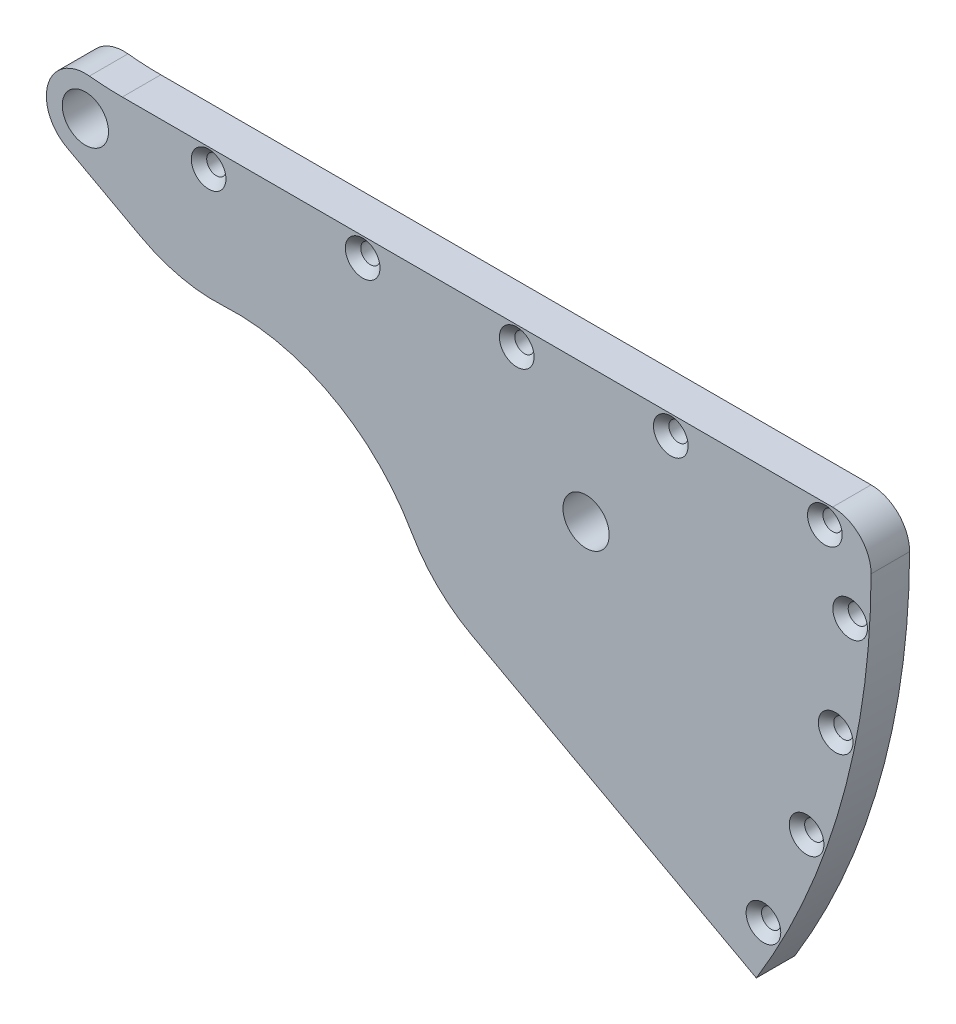
ISO-10303-21;
HEADER;
FILE_DESCRIPTION(('STEP AP214'),'2;1');
FILE_NAME('part.step','',(''),(''),'','','');
FILE_SCHEMA(('AUTOMOTIVE_DESIGN { 1 0 10303 214 1 1 1 1 }'));
ENDSEC;
DATA;
#1=APPLICATION_CONTEXT('core data for automotive mechanical design processes');
#2=APPLICATION_PROTOCOL_DEFINITION('international standard','automotive_design',2000,#1);
#3=PRODUCT_CONTEXT('',#1,'mechanical');
#4=PRODUCT('Part','Part','',(#3));
#5=PRODUCT_RELATED_PRODUCT_CATEGORY('part','',(#4));
#6=PRODUCT_DEFINITION_FORMATION('','',#4);
#7=PRODUCT_DEFINITION_CONTEXT('part definition',#1,'design');
#8=PRODUCT_DEFINITION('design','',#6,#7);
#9=PRODUCT_DEFINITION_SHAPE('','',#8);
#10=(LENGTH_UNIT() NAMED_UNIT(*) SI_UNIT(.MILLI.,.METRE.));
#11=(NAMED_UNIT(*) PLANE_ANGLE_UNIT() SI_UNIT($,.RADIAN.));
#12=(NAMED_UNIT(*) SI_UNIT($,.STERADIAN.) SOLID_ANGLE_UNIT());
#13=UNCERTAINTY_MEASURE_WITH_UNIT(LENGTH_MEASURE(1.E-05),#10,'distance_accuracy_value','');
#14=(GEOMETRIC_REPRESENTATION_CONTEXT(3) GLOBAL_UNCERTAINTY_ASSIGNED_CONTEXT((#13)) GLOBAL_UNIT_ASSIGNED_CONTEXT((#10,
#11,#12)) REPRESENTATION_CONTEXT('',''));
#15=CARTESIAN_POINT('',(0.,0.,0.));
#16=DIRECTION('',(0.,0.,1.));
#17=DIRECTION('',(1.,0.,0.));
#18=AXIS2_PLACEMENT_3D('',#15,#16,#17);
#19=CARTESIAN_POINT('',(-74.8359122898312,-21.2714060431212,10.));
#20=DIRECTION('',(0.477305120545533,0.878737629728587,0.));
#21=DIRECTION('',(-0.878737629728587,0.477305120545533,0.));
#22=AXIS2_PLACEMENT_3D('',#19,#20,#21);
#23=PLANE('',#22);
#24=DIRECTION('',(0.878737629728586,-0.477305120545533,0.));
#25=VECTOR('',#24,1.);
#26=CARTESIAN_POINT('',(-74.8359122898312,-21.2714060431212,0.));
#27=LINE('',#26,#25);
#28=CARTESIAN_POINT('',(-74.8359122898312,-21.2714060431212,0.));
#29=VERTEX_POINT('',#28);
#30=CARTESIAN_POINT('',(-55.4848672615979,-31.7823396453794,0.));
#31=VERTEX_POINT('',#30);
#32=EDGE_CURVE('E149',#29,#31,#27,.T.);
#33=ORIENTED_EDGE('',*,*,#32,.T.);
#34=DIRECTION('',(0.,0.,1.));
#35=VECTOR('',#34,1.);
#36=CARTESIAN_POINT('',(-55.4848672615979,-31.7823396453794,10.));
#37=LINE('',#36,#35);
#38=CARTESIAN_POINT('',(-55.4848672615979,-31.7823396453794,10.));
#39=VERTEX_POINT('',#38);
#40=EDGE_CURVE('E131',#31,#39,#37,.T.);
#41=ORIENTED_EDGE('',*,*,#40,.T.);
#42=DIRECTION('',(0.878737629728586,-0.477305120545533,0.));
#43=VECTOR('',#42,1.);
#44=CARTESIAN_POINT('',(-74.8359122898312,-21.2714060431212,10.));
#45=LINE('',#44,#43);
#46=CARTESIAN_POINT('',(-74.8359122898312,-21.2714060431212,10.));
#47=VERTEX_POINT('',#46);
#48=EDGE_CURVE('E116',#47,#39,#45,.T.);
#49=ORIENTED_EDGE('',*,*,#48,.F.);
#50=DIRECTION('',(0.,0.,-1.));
#51=VECTOR('',#50,1.);
#52=CARTESIAN_POINT('',(-74.8359122898312,-21.2714060431212,10.));
#53=LINE('',#52,#51);
#54=EDGE_CURVE('E125',#47,#29,#53,.T.);
#55=ORIENTED_EDGE('',*,*,#54,.T.);
#56=EDGE_LOOP('',(#33,#41,#49,#55));
#57=FACE_BOUND('',#56,.T.);
#58=ADVANCED_FACE('F33',(#57),#23,.F.);
#59=CARTESIAN_POINT('',(-70.,-12.3683000000001,10.));
#60=DIRECTION('',(0.,0.,1.));
#61=DIRECTION('',(1.,0.,0.));
#62=AXIS2_PLACEMENT_3D('',#59,#60,#61);
#63=PLANE('',#62);
#64=CARTESIAN_POINT('',(124.804036909517,-53.0178658495351,10.));
#65=DIRECTION('',(0.,0.,1.));
#66=DIRECTION('',(1.,0.,0.));
#67=AXIS2_PLACEMENT_3D('',#64,#65,#66);
#68=CIRCLE('',#67,4.50000000000001);
#69=CARTESIAN_POINT('',(129.304036909517,-53.0178658495351,10.));
#70=VERTEX_POINT('',#69);
#71=EDGE_CURVE('E228',#70,#70,#68,.F.);
#72=ORIENTED_EDGE('',*,*,#71,.T.);
#73=EDGE_LOOP('',(#72));
#74=FACE_BOUND('',#73,.T.);
#75=CARTESIAN_POINT('',(117.250891281488,-79.7337489652391,10.));
#76=DIRECTION('',(0.,0.,1.));
#77=DIRECTION('',(1.,0.,0.));
#78=AXIS2_PLACEMENT_3D('',#75,#76,#77);
#79=CIRCLE('',#78,4.49999999999997);
#80=CARTESIAN_POINT('',(121.750891281488,-79.7337489652391,10.));
#81=VERTEX_POINT('',#80);
#82=EDGE_CURVE('E222',#81,#81,#79,.F.);
#83=ORIENTED_EDGE('',*,*,#82,.T.);
#84=EDGE_LOOP('',(#83));
#85=FACE_BOUND('',#84,.T.);
#86=CARTESIAN_POINT('',(106.053120049398,-105.138440243897,10.));
#87=DIRECTION('',(0.,0.,1.));
#88=DIRECTION('',(1.,0.,0.));
#89=AXIS2_PLACEMENT_3D('',#86,#87,#88);
#90=CIRCLE('',#89,4.49999999999998);
#91=CARTESIAN_POINT('',(110.553120049398,-105.138440243897,10.));
#92=VERTEX_POINT('',#91);
#93=EDGE_CURVE('E216',#92,#92,#90,.F.);
#94=ORIENTED_EDGE('',*,*,#93,.T.);
#95=EDGE_LOOP('',(#94));
#96=FACE_BOUND('',#95,.T.);
#97=CARTESIAN_POINT('',(128.565543545409,-25.5107851727687,10.));
#98=DIRECTION('',(0.,0.,1.));
#99=DIRECTION('',(1.,0.,0.));
#100=AXIS2_PLACEMENT_3D('',#97,#98,#99);
#101=CIRCLE('',#100,4.50000000000003);
#102=CARTESIAN_POINT('',(133.065543545409,-25.5107851727687,10.));
#103=VERTEX_POINT('',#102);
#104=EDGE_CURVE('E210',#103,#103,#101,.F.);
#105=ORIENTED_EDGE('',*,*,#104,.T.);
#106=EDGE_LOOP('',(#105));
#107=FACE_BOUND('',#106,.T.);
#108=CARTESIAN_POINT('',(-38.,-7.73660000000008,10.));
#109=DIRECTION('',(0.,0.,1.));
#110=DIRECTION('',(1.,0.,0.));
#111=AXIS2_PLACEMENT_3D('',#108,#109,#110);
#112=CIRCLE('',#111,4.50000000000003);
#113=CARTESIAN_POINT('',(-33.5,-7.73660000000008,10.));
#114=VERTEX_POINT('',#113);
#115=EDGE_CURVE('E204',#114,#114,#112,.F.);
#116=ORIENTED_EDGE('',*,*,#115,.T.);
#117=EDGE_LOOP('',(#116));
#118=FACE_BOUND('',#117,.T.);
#119=CARTESIAN_POINT('',(1.99999999999999,-7.73660000000007,10.));
#120=DIRECTION('',(0.,0.,1.));
#121=DIRECTION('',(1.,0.,0.));
#122=AXIS2_PLACEMENT_3D('',#119,#120,#121);
#123=CIRCLE('',#122,4.50000000000003);
#124=CARTESIAN_POINT('',(6.50000000000002,-7.73660000000007,10.));
#125=VERTEX_POINT('',#124);
#126=EDGE_CURVE('E198',#125,#125,#123,.F.);
#127=ORIENTED_EDGE('',*,*,#126,.T.);
#128=EDGE_LOOP('',(#127));
#129=FACE_BOUND('',#128,.T.);
#130=CARTESIAN_POINT('',(42.,-7.73660000000007,10.));
#131=DIRECTION('',(0.,0.,1.));
#132=DIRECTION('',(1.,0.,0.));
#133=AXIS2_PLACEMENT_3D('',#130,#131,#132);
#134=CIRCLE('',#133,4.50000000000003);
#135=CARTESIAN_POINT('',(46.5,-7.73660000000007,10.));
#136=VERTEX_POINT('',#135);
#137=EDGE_CURVE('E192',#136,#136,#134,.F.);
#138=ORIENTED_EDGE('',*,*,#137,.T.);
#139=EDGE_LOOP('',(#138));
#140=FACE_BOUND('',#139,.T.);
#141=CARTESIAN_POINT('',(82.,-7.73660000000007,10.));
#142=DIRECTION('',(0.,0.,1.));
#143=DIRECTION('',(1.,0.,0.));
#144=AXIS2_PLACEMENT_3D('',#141,#142,#143);
#145=CIRCLE('',#144,4.50000000000003);
#146=CARTESIAN_POINT('',(86.5,-7.73660000000007,10.));
#147=VERTEX_POINT('',#146);
#148=EDGE_CURVE('E186',#147,#147,#145,.F.);
#149=ORIENTED_EDGE('',*,*,#148,.T.);
#150=EDGE_LOOP('',(#149));
#151=FACE_BOUND('',#150,.T.);
#152=CARTESIAN_POINT('',(122.,-7.73660000000007,10.));
#153=DIRECTION('',(0.,0.,1.));
#154=DIRECTION('',(1.,0.,0.));
#155=AXIS2_PLACEMENT_3D('',#152,#153,#154);
#156=CIRCLE('',#155,4.5000000000001);
#157=CARTESIAN_POINT('',(126.5,-7.73660000000007,10.));
#158=VERTEX_POINT('',#157);
#159=EDGE_CURVE('E171',#158,#158,#156,.F.);
#160=ORIENTED_EDGE('',*,*,#159,.T.);
#161=EDGE_LOOP('',(#160));
#162=FACE_BOUND('',#161,.T.);
#163=CARTESIAN_POINT('',(-70.,-12.3683000000001,10.));
#164=DIRECTION('',(0.,0.,1.));
#165=DIRECTION('',(1.,0.,0.));
#166=AXIS2_PLACEMENT_3D('',#163,#164,#165);
#167=CIRCLE('',#166,204.);
#168=CARTESIAN_POINT('',(104.20534041752,-118.52148822351,10.));
#169=VERTEX_POINT('',#168);
#170=CARTESIAN_POINT('',(133.999632378806,-12.7555845360825,10.));
#171=VERTEX_POINT('',#170);
#172=EDGE_CURVE('E150',#169,#171,#167,.T.);
#173=ORIENTED_EDGE('',*,*,#172,.T.);
#174=CARTESIAN_POINT('',(123.999650399453,-12.7366000000001,10.));
#175=DIRECTION('',(0.,0.,1.));
#176=DIRECTION('',(1.,0.,0.));
#177=AXIS2_PLACEMENT_3D('',#174,#175,#176);
#178=CIRCLE('',#177,10.);
#179=CARTESIAN_POINT('',(123.999650399453,-2.73660000000007,10.));
#180=VERTEX_POINT('',#179);
#181=EDGE_CURVE('E181',#171,#180,#178,.T.);
#182=ORIENTED_EDGE('',*,*,#181,.T.);
#183=DIRECTION('',(-1.,0.,0.));
#184=VECTOR('',#183,1.);
#185=CARTESIAN_POINT('',(134.,-2.73660000000007,10.));
#186=LINE('',#185,#184);
#187=CARTESIAN_POINT('',(-60.4145057508754,-2.73660000000008,10.));
#188=VERTEX_POINT('',#187);
#189=EDGE_CURVE('E122',#180,#188,#186,.T.);
#190=ORIENTED_EDGE('',*,*,#189,.T.);
#191=CARTESIAN_POINT('',(-60.4145057508754,79.2633999999999,10.));
#192=DIRECTION('',(0.,0.,1.));
#193=DIRECTION('',(1.,0.,0.));
#194=AXIS2_PLACEMENT_3D('',#191,#192,#193);
#195=CIRCLE('',#194,82.);
#196=CARTESIAN_POINT('',(-68.9458855954698,-2.29158487491284,10.));
#197=VERTEX_POINT('',#196);
#198=EDGE_CURVE('E11',#188,#197,#195,.F.);
#199=ORIENTED_EDGE('',*,*,#198,.T.);
#200=CARTESIAN_POINT('',(-70.,-12.3683000000001,10.));
#201=DIRECTION('',(0.,0.,1.));
#202=DIRECTION('',(1.,0.,0.));
#203=AXIS2_PLACEMENT_3D('',#200,#201,#202);
#204=CIRCLE('',#203,10.1317);
#205=EDGE_CURVE('E110',#197,#47,#204,.T.);
#206=ORIENTED_EDGE('',*,*,#205,.T.);
#207=ORIENTED_EDGE('',*,*,#48,.T.);
#208=CARTESIAN_POINT('',(-36.3926624397765,3.36716554376406,10.));
#209=DIRECTION('',(0.,0.,1.));
#210=DIRECTION('',(1.,0.,0.));
#211=AXIS2_PLACEMENT_3D('',#208,#209,#210);
#212=CIRCLE('',#211,40.);
#213=CARTESIAN_POINT('',(-34.1104429036796,-36.5676748088536,10.));
#214=VERTEX_POINT('',#213);
#215=EDGE_CURVE('E155',#39,#214,#212,.T.);
#216=ORIENTED_EDGE('',*,*,#215,.T.);
#217=CARTESIAN_POINT('',(-31.1020131785029,-89.2099201699054,10.));
#218=DIRECTION('',(0.,0.,1.));
#219=DIRECTION('',(1.,0.,0.));
#220=AXIS2_PLACEMENT_3D('',#217,#218,#219);
#221=CIRCLE('',#220,52.7281390347176);
#222=CARTESIAN_POINT('',(14.6947042322307,-63.0772333492602,10.));
#223=VERTEX_POINT('',#222);
#224=EDGE_CURVE('E242',#223,#214,#221,.T.);
#225=ORIENTED_EDGE('',*,*,#224,.F.);
#226=CARTESIAN_POINT('',(49.4364707721648,-43.2527621662824,10.));
#227=DIRECTION('',(0.,0.,1.));
#228=DIRECTION('',(1.,0.,0.));
#229=AXIS2_PLACEMENT_3D('',#226,#227,#228);
#230=CIRCLE('',#229,40.);
#231=CARTESIAN_POINT('',(30.3442659503435,-78.4022673554259,10.));
#232=VERTEX_POINT('',#231);
#233=EDGE_CURVE('E153',#223,#232,#230,.T.);
#234=ORIENTED_EDGE('',*,*,#233,.T.);
#235=EDGE_CURVE('E121',#232,#169,#45,.T.);
#236=ORIENTED_EDGE('',*,*,#235,.T.);
#237=EDGE_LOOP('',(#173,#182,#190,#199,#206,#207,#216,#225,#234,#236));
#238=FACE_BOUND('',#237,.T.);
#239=CARTESIAN_POINT('',(60.,-38.0000000000001,10.));
#240=DIRECTION('',(0.,0.,1.));
#241=DIRECTION('',(1.,0.,0.));
#242=AXIS2_PLACEMENT_3D('',#239,#240,#241);
#243=CIRCLE('',#242,6.);
#244=CARTESIAN_POINT('',(66.,-38.0000000000001,10.));
#245=VERTEX_POINT('',#244);
#246=EDGE_CURVE('E259',#245,#245,#243,.T.);
#247=ORIENTED_EDGE('',*,*,#246,.F.);
#248=EDGE_LOOP('',(#247));
#249=FACE_BOUND('',#248,.T.);
#250=CARTESIAN_POINT('',(-70.,-12.3683000000001,10.));
#251=DIRECTION('',(0.,0.,1.));
#252=DIRECTION('',(1.,0.,0.));
#253=AXIS2_PLACEMENT_3D('',#250,#251,#252);
#254=CIRCLE('',#253,6.);
#255=CARTESIAN_POINT('',(-64.,-12.3683000000001,10.));
#256=VERTEX_POINT('',#255);
#257=EDGE_CURVE('E251',#256,#256,#254,.T.);
#258=ORIENTED_EDGE('',*,*,#257,.F.);
#259=EDGE_LOOP('',(#258));
#260=FACE_BOUND('',#259,.T.);
#261=ADVANCED_FACE('F113',(#74,#85,#96,#107,#118,#129,#140,#151,#162,#238,#249,#260),#63,.T.);
#262=CARTESIAN_POINT('',(-70.,-12.3683000000001,0.));
#263=DIRECTION('',(0.,0.,1.));
#264=DIRECTION('',(1.,0.,0.));
#265=AXIS2_PLACEMENT_3D('',#262,#263,#264);
#266=PLANE('',#265);
#267=CARTESIAN_POINT('',(106.053120049398,-105.138440243897,0.));
#268=DIRECTION('',(0.,0.,1.));
#269=DIRECTION('',(0.913545457642606,-0.406736643075789,0.));
#270=AXIS2_PLACEMENT_3D('',#267,#268,#269);
#271=CIRCLE('',#270,2.5);
#272=CARTESIAN_POINT('',(108.336983693504,-106.155281851586,0.));
#273=VERTEX_POINT('',#272);
#274=EDGE_CURVE('E373',#273,#273,#271,.T.);
#275=ORIENTED_EDGE('',*,*,#274,.T.);
#276=EDGE_LOOP('',(#275));
#277=FACE_BOUND('',#276,.T.);
#278=CARTESIAN_POINT('',(117.250891281488,-79.7337489652391,0.));
#279=DIRECTION('',(0.,0.,1.));
#280=DIRECTION('',(0.961261695938322,-0.275637355816987,0.));
#281=AXIS2_PLACEMENT_3D('',#278,#279,#280);
#282=CIRCLE('',#281,2.5);
#283=CARTESIAN_POINT('',(119.654045521334,-80.4228423547816,0.));
#284=VERTEX_POINT('',#283);
#285=EDGE_CURVE('E371',#284,#284,#282,.T.);
#286=ORIENTED_EDGE('',*,*,#285,.T.);
#287=EDGE_LOOP('',(#286));
#288=FACE_BOUND('',#287,.T.);
#289=CARTESIAN_POINT('',(124.804036909517,-53.0178658495351,0.));
#290=DIRECTION('',(0.,0.,1.));
#291=DIRECTION('',(0.990268068741572,-0.139173100960052,0.));
#292=AXIS2_PLACEMENT_3D('',#289,#290,#291);
#293=CIRCLE('',#292,2.5);
#294=CARTESIAN_POINT('',(127.27970708137,-53.3657986019352,0.));
#295=VERTEX_POINT('',#294);
#296=EDGE_CURVE('E374',#295,#295,#293,.T.);
#297=ORIENTED_EDGE('',*,*,#296,.T.);
#298=EDGE_LOOP('',(#297));
#299=FACE_BOUND('',#298,.T.);
#300=CARTESIAN_POINT('',(128.565543545409,-25.5107851727687,0.));
#301=DIRECTION('',(0.,0.,1.));
#302=DIRECTION('',(1.,0.,0.));
#303=AXIS2_PLACEMENT_3D('',#300,#301,#302);
#304=CIRCLE('',#303,2.5);
#305=CARTESIAN_POINT('',(131.065543545409,-25.5107851727687,0.));
#306=VERTEX_POINT('',#305);
#307=EDGE_CURVE('E377',#306,#306,#304,.T.);
#308=ORIENTED_EDGE('',*,*,#307,.T.);
#309=EDGE_LOOP('',(#308));
#310=FACE_BOUND('',#309,.T.);
#311=CARTESIAN_POINT('',(82.,-7.73660000000007,0.));
#312=DIRECTION('',(0.,0.,1.));
#313=DIRECTION('',(1.,0.,0.));
#314=AXIS2_PLACEMENT_3D('',#311,#312,#313);
#315=CIRCLE('',#314,2.49999999999999);
#316=CARTESIAN_POINT('',(84.5,-7.73660000000007,0.));
#317=VERTEX_POINT('',#316);
#318=EDGE_CURVE('E254',#317,#317,#315,.T.);
#319=ORIENTED_EDGE('',*,*,#318,.T.);
#320=EDGE_LOOP('',(#319));
#321=FACE_BOUND('',#320,.T.);
#322=CARTESIAN_POINT('',(42.,-7.73660000000007,0.));
#323=DIRECTION('',(0.,0.,1.));
#324=DIRECTION('',(1.,0.,0.));
#325=AXIS2_PLACEMENT_3D('',#322,#323,#324);
#326=CIRCLE('',#325,2.49999999999999);
#327=CARTESIAN_POINT('',(44.5,-7.73660000000007,0.));
#328=VERTEX_POINT('',#327);
#329=EDGE_CURVE('E387',#328,#328,#326,.T.);
#330=ORIENTED_EDGE('',*,*,#329,.T.);
#331=EDGE_LOOP('',(#330));
#332=FACE_BOUND('',#331,.T.);
#333=CARTESIAN_POINT('',(1.99999999999999,-7.73660000000007,0.));
#334=DIRECTION('',(0.,0.,1.));
#335=DIRECTION('',(1.,0.,0.));
#336=AXIS2_PLACEMENT_3D('',#333,#334,#335);
#337=CIRCLE('',#336,2.49999999999999);
#338=CARTESIAN_POINT('',(4.49999999999998,-7.73660000000007,0.));
#339=VERTEX_POINT('',#338);
#340=EDGE_CURVE('E390',#339,#339,#337,.T.);
#341=ORIENTED_EDGE('',*,*,#340,.T.);
#342=EDGE_LOOP('',(#341));
#343=FACE_BOUND('',#342,.T.);
#344=CARTESIAN_POINT('',(-38.,-7.73660000000008,0.));
#345=DIRECTION('',(0.,0.,1.));
#346=DIRECTION('',(1.,0.,0.));
#347=AXIS2_PLACEMENT_3D('',#344,#345,#346);
#348=CIRCLE('',#347,2.49999999999999);
#349=CARTESIAN_POINT('',(-35.5,-7.73660000000008,0.));
#350=VERTEX_POINT('',#349);
#351=EDGE_CURVE('E384',#350,#350,#348,.T.);
#352=ORIENTED_EDGE('',*,*,#351,.T.);
#353=EDGE_LOOP('',(#352));
#354=FACE_BOUND('',#353,.T.);
#355=CARTESIAN_POINT('',(122.,-7.73660000000007,0.));
#356=DIRECTION('',(0.,0.,1.));
#357=DIRECTION('',(1.,0.,0.));
#358=AXIS2_PLACEMENT_3D('',#355,#356,#357);
#359=CIRCLE('',#358,2.49999999999999);
#360=CARTESIAN_POINT('',(124.5,-7.73660000000007,0.));
#361=VERTEX_POINT('',#360);
#362=EDGE_CURVE('E249',#361,#361,#359,.T.);
#363=ORIENTED_EDGE('',*,*,#362,.T.);
#364=EDGE_LOOP('',(#363));
#365=FACE_BOUND('',#364,.T.);
#366=CARTESIAN_POINT('',(60.,-38.0000000000001,0.));
#367=DIRECTION('',(0.,0.,1.));
#368=DIRECTION('',(1.,0.,0.));
#369=AXIS2_PLACEMENT_3D('',#366,#367,#368);
#370=CIRCLE('',#369,6.);
#371=CARTESIAN_POINT('',(66.,-38.0000000000001,0.));
#372=VERTEX_POINT('',#371);
#373=EDGE_CURVE('E145',#372,#372,#370,.T.);
#374=ORIENTED_EDGE('',*,*,#373,.T.);
#375=EDGE_LOOP('',(#374));
#376=FACE_BOUND('',#375,.T.);
#377=CARTESIAN_POINT('',(-70.,-12.3683000000001,0.));
#378=DIRECTION('',(0.,0.,1.));
#379=DIRECTION('',(1.,0.,0.));
#380=AXIS2_PLACEMENT_3D('',#377,#378,#379);
#381=CIRCLE('',#380,6.);
#382=CARTESIAN_POINT('',(-64.,-12.3683000000001,0.));
#383=VERTEX_POINT('',#382);
#384=EDGE_CURVE('E262',#383,#383,#381,.T.);
#385=ORIENTED_EDGE('',*,*,#384,.T.);
#386=EDGE_LOOP('',(#385));
#387=FACE_BOUND('',#386,.T.);
#388=DIRECTION('',(-1.,0.,0.));
#389=VECTOR('',#388,1.);
#390=CARTESIAN_POINT('',(134.,-2.73660000000007,0.));
#391=LINE('',#390,#389);
#392=CARTESIAN_POINT('',(123.999650399453,-2.73660000000007,0.));
#393=VERTEX_POINT('',#392);
#394=CARTESIAN_POINT('',(-60.4145057508754,-2.73660000000008,0.));
#395=VERTEX_POINT('',#394);
#396=EDGE_CURVE('E144',#393,#395,#391,.T.);
#397=ORIENTED_EDGE('',*,*,#396,.F.);
#398=CARTESIAN_POINT('',(123.999650399453,-12.7366000000001,0.));
#399=DIRECTION('',(0.,0.,1.));
#400=DIRECTION('',(1.,0.,0.));
#401=AXIS2_PLACEMENT_3D('',#398,#399,#400);
#402=CIRCLE('',#401,10.);
#403=CARTESIAN_POINT('',(133.999632378806,-12.7555845360825,0.));
#404=VERTEX_POINT('',#403);
#405=EDGE_CURVE('E177',#393,#404,#402,.F.);
#406=ORIENTED_EDGE('',*,*,#405,.T.);
#407=CARTESIAN_POINT('',(-70.,-12.3683000000003,0.));
#408=DIRECTION('',(0.,0.,1.));
#409=DIRECTION('',(1.,0.,0.));
#410=AXIS2_PLACEMENT_3D('',#407,#408,#409);
#411=CIRCLE('',#410,204.);
#412=CARTESIAN_POINT('',(104.20534041752,-118.52148822351,0.));
#413=VERTEX_POINT('',#412);
#414=EDGE_CURVE('E141',#413,#404,#411,.T.);
#415=ORIENTED_EDGE('',*,*,#414,.F.);
#416=CARTESIAN_POINT('',(30.3442659503435,-78.4022673554259,0.));
#417=VERTEX_POINT('',#416);
#418=EDGE_CURVE('E148',#417,#413,#27,.T.);
#419=ORIENTED_EDGE('',*,*,#418,.F.);
#420=CARTESIAN_POINT('',(49.4364707721648,-43.2527621662824,0.));
#421=DIRECTION('',(0.,0.,1.));
#422=DIRECTION('',(1.,0.,0.));
#423=AXIS2_PLACEMENT_3D('',#420,#421,#422);
#424=CIRCLE('',#423,40.);
#425=CARTESIAN_POINT('',(14.6947042322307,-63.0772333492602,0.));
#426=VERTEX_POINT('',#425);
#427=EDGE_CURVE('E161',#417,#426,#424,.F.);
#428=ORIENTED_EDGE('',*,*,#427,.T.);
#429=CARTESIAN_POINT('',(-31.1020131785029,-89.2099201699054,0.));
#430=DIRECTION('',(0.,0.,1.));
#431=DIRECTION('',(1.,0.,0.));
#432=AXIS2_PLACEMENT_3D('',#429,#430,#431);
#433=CIRCLE('',#432,52.7281390347176);
#434=CARTESIAN_POINT('',(-34.1104429036796,-36.5676748088536,0.));
#435=VERTEX_POINT('',#434);
#436=EDGE_CURVE('E248',#426,#435,#433,.T.);
#437=ORIENTED_EDGE('',*,*,#436,.T.);
#438=CARTESIAN_POINT('',(-36.3926624397765,3.36716554376406,0.));
#439=DIRECTION('',(0.,0.,1.));
#440=DIRECTION('',(1.,0.,0.));
#441=AXIS2_PLACEMENT_3D('',#438,#439,#440);
#442=CIRCLE('',#441,40.);
#443=EDGE_CURVE('E163',#435,#31,#442,.F.);
#444=ORIENTED_EDGE('',*,*,#443,.T.);
#445=ORIENTED_EDGE('',*,*,#32,.F.);
#446=CARTESIAN_POINT('',(-70.,-12.3683000000001,0.));
#447=DIRECTION('',(0.,0.,1.));
#448=DIRECTION('',(1.,0.,0.));
#449=AXIS2_PLACEMENT_3D('',#446,#447,#448);
#450=CIRCLE('',#449,10.1317);
#451=CARTESIAN_POINT('',(-68.9458855954698,-2.29158487491284,0.));
#452=VERTEX_POINT('',#451);
#453=EDGE_CURVE('E127',#452,#29,#450,.T.);
#454=ORIENTED_EDGE('',*,*,#453,.F.);
#455=CARTESIAN_POINT('',(-60.4145057508754,79.2633999999999,0.));
#456=DIRECTION('',(0.,0.,1.));
#457=DIRECTION('',(1.,0.,0.));
#458=AXIS2_PLACEMENT_3D('',#455,#456,#457);
#459=CIRCLE('',#458,82.);
#460=EDGE_CURVE('E41',#452,#395,#459,.T.);
#461=ORIENTED_EDGE('',*,*,#460,.T.);
#462=EDGE_LOOP('',(#397,#406,#415,#419,#428,#437,#444,#445,#454,#461));
#463=FACE_BOUND('',#462,.T.);
#464=ADVANCED_FACE('F234',(#277,#288,#299,#310,#321,#332,#343,#354,#365,#376,#387,#463),#266,.F.);
#465=CARTESIAN_POINT('',(-70.,-12.3683000000003,10.));
#466=DIRECTION('',(0.,0.,-1.));
#467=DIRECTION('',(-1.,0.,0.));
#468=AXIS2_PLACEMENT_3D('',#465,#466,#467);
#469=CYLINDRICAL_SURFACE('',#468,204.);
#470=ORIENTED_EDGE('',*,*,#414,.T.);
#471=DIRECTION('',(0.,0.,-1.));
#472=VECTOR('',#471,1.);
#473=CARTESIAN_POINT('',(133.999632378806,-12.7555845360825,10.));
#474=LINE('',#473,#472);
#475=EDGE_CURVE('E179',#404,#171,#474,.F.);
#476=ORIENTED_EDGE('',*,*,#475,.T.);
#477=ORIENTED_EDGE('',*,*,#172,.F.);
#478=DIRECTION('',(0.,0.,-1.));
#479=VECTOR('',#478,1.);
#480=CARTESIAN_POINT('',(104.20534041752,-118.52148822351,10.));
#481=LINE('',#480,#479);
#482=EDGE_CURVE('E132',#169,#413,#481,.T.);
#483=ORIENTED_EDGE('',*,*,#482,.T.);
#484=EDGE_LOOP('',(#470,#476,#477,#483));
#485=FACE_BOUND('',#484,.T.);
#486=ADVANCED_FACE('F307',(#485),#469,.T.);
#487=CARTESIAN_POINT('',(134.,-2.73660000000007,10.));
#488=DIRECTION('',(0.,-1.,0.));
#489=DIRECTION('',(1.,0.,0.));
#490=AXIS2_PLACEMENT_3D('',#487,#488,#489);
#491=PLANE('',#490);
#492=ORIENTED_EDGE('',*,*,#396,.T.);
#493=DIRECTION('',(0.,0.,1.));
#494=VECTOR('',#493,1.);
#495=CARTESIAN_POINT('',(-60.4145057508754,-2.73660000000008,10.));
#496=LINE('',#495,#494);
#497=EDGE_CURVE('E54',#395,#188,#496,.T.);
#498=ORIENTED_EDGE('',*,*,#497,.T.);
#499=ORIENTED_EDGE('',*,*,#189,.F.);
#500=DIRECTION('',(0.,0.,-1.));
#501=VECTOR('',#500,1.);
#502=CARTESIAN_POINT('',(123.999650399453,-2.73660000000007,10.));
#503=LINE('',#502,#501);
#504=EDGE_CURVE('E174',#180,#393,#503,.T.);
#505=ORIENTED_EDGE('',*,*,#504,.T.);
#506=EDGE_LOOP('',(#492,#498,#499,#505));
#507=FACE_BOUND('',#506,.T.);
#508=ADVANCED_FACE('F296',(#507),#491,.F.);
#509=CARTESIAN_POINT('',(-70.,-12.3683000000001,10.));
#510=DIRECTION('',(0.,0.,-1.));
#511=DIRECTION('',(-1.,0.,0.));
#512=AXIS2_PLACEMENT_3D('',#509,#510,#511);
#513=CYLINDRICAL_SURFACE('',#512,10.1317);
#514=ORIENTED_EDGE('',*,*,#205,.F.);
#515=DIRECTION('',(0.,0.,-1.));
#516=VECTOR('',#515,1.);
#517=CARTESIAN_POINT('',(-68.9458855954698,-2.29158487491284,10.));
#518=LINE('',#517,#516);
#519=EDGE_CURVE('E231',#197,#452,#518,.T.);
#520=ORIENTED_EDGE('',*,*,#519,.T.);
#521=ORIENTED_EDGE('',*,*,#453,.T.);
#522=ORIENTED_EDGE('',*,*,#54,.F.);
#523=EDGE_LOOP('',(#514,#520,#521,#522));
#524=FACE_BOUND('',#523,.T.);
#525=ADVANCED_FACE('F126',(#524),#513,.T.);
#526=ORIENTED_EDGE('',*,*,#235,.F.);
#527=DIRECTION('',(0.,0.,1.));
#528=VECTOR('',#527,1.);
#529=CARTESIAN_POINT('',(30.3442659503435,-78.4022673554258,10.));
#530=LINE('',#529,#528);
#531=EDGE_CURVE('E165',#232,#417,#530,.F.);
#532=ORIENTED_EDGE('',*,*,#531,.T.);
#533=ORIENTED_EDGE('',*,*,#418,.T.);
#534=ORIENTED_EDGE('',*,*,#482,.F.);
#535=EDGE_LOOP('',(#526,#532,#533,#534));
#536=FACE_BOUND('',#535,.T.);
#537=ADVANCED_FACE('F278',(#536),#23,.F.);
#538=CARTESIAN_POINT('',(-70.,-12.3683000000001,0.));
#539=DIRECTION('',(0.,0.,1.));
#540=DIRECTION('',(1.,0.,0.));
#541=AXIS2_PLACEMENT_3D('',#538,#539,#540);
#542=CYLINDRICAL_SURFACE('',#541,6.);
#543=ORIENTED_EDGE('',*,*,#384,.F.);
#544=EDGE_LOOP('',(#543));
#545=FACE_BOUND('',#544,.T.);
#546=ORIENTED_EDGE('',*,*,#257,.T.);
#547=EDGE_LOOP('',(#546));
#548=FACE_BOUND('',#547,.T.);
#549=ADVANCED_FACE('F287',(#545,#548),#542,.F.);
#550=CARTESIAN_POINT('',(60.,-38.0000000000001,0.));
#551=DIRECTION('',(0.,0.,1.));
#552=DIRECTION('',(1.,0.,0.));
#553=AXIS2_PLACEMENT_3D('',#550,#551,#552);
#554=CYLINDRICAL_SURFACE('',#553,6.);
#555=ORIENTED_EDGE('',*,*,#373,.F.);
#556=EDGE_LOOP('',(#555));
#557=FACE_BOUND('',#556,.T.);
#558=ORIENTED_EDGE('',*,*,#246,.T.);
#559=EDGE_LOOP('',(#558));
#560=FACE_BOUND('',#559,.T.);
#561=ADVANCED_FACE('F293',(#557,#560),#554,.F.);
#562=CARTESIAN_POINT('',(-31.1020131785029,-89.2099201699054,0.));
#563=DIRECTION('',(0.,0.,1.));
#564=DIRECTION('',(1.,0.,0.));
#565=AXIS2_PLACEMENT_3D('',#562,#563,#564);
#566=CYLINDRICAL_SURFACE('',#565,52.7281390347176);
#567=ORIENTED_EDGE('',*,*,#224,.T.);
#568=DIRECTION('',(0.,0.,1.));
#569=VECTOR('',#568,1.);
#570=CARTESIAN_POINT('',(-34.1104429036796,-36.5676748088536,0.));
#571=LINE('',#570,#569);
#572=EDGE_CURVE('E159',#214,#435,#571,.F.);
#573=ORIENTED_EDGE('',*,*,#572,.T.);
#574=ORIENTED_EDGE('',*,*,#436,.F.);
#575=DIRECTION('',(0.,0.,1.));
#576=VECTOR('',#575,1.);
#577=CARTESIAN_POINT('',(14.6947042322307,-63.0772333492602,0.));
#578=LINE('',#577,#576);
#579=EDGE_CURVE('E157',#426,#223,#578,.T.);
#580=ORIENTED_EDGE('',*,*,#579,.T.);
#581=EDGE_LOOP('',(#567,#573,#574,#580));
#582=FACE_BOUND('',#581,.T.);
#583=ADVANCED_FACE('F245',(#582),#566,.F.);
#584=CARTESIAN_POINT('',(-36.3926624397765,3.36716554376406,0.));
#585=DIRECTION('',(0.,0.,1.));
#586=DIRECTION('',(1.,0.,0.));
#587=AXIS2_PLACEMENT_3D('',#584,#585,#586);
#588=CYLINDRICAL_SURFACE('',#587,40.);
#589=ORIENTED_EDGE('',*,*,#443,.F.);
#590=ORIENTED_EDGE('',*,*,#572,.F.);
#591=ORIENTED_EDGE('',*,*,#215,.F.);
#592=ORIENTED_EDGE('',*,*,#40,.F.);
#593=EDGE_LOOP('',(#589,#590,#591,#592));
#594=FACE_BOUND('',#593,.T.);
#595=ADVANCED_FACE('F238',(#594),#588,.T.);
#596=CARTESIAN_POINT('',(49.4364707721648,-43.2527621662824,0.));
#597=DIRECTION('',(0.,0.,1.));
#598=DIRECTION('',(1.,0.,0.));
#599=AXIS2_PLACEMENT_3D('',#596,#597,#598);
#600=CYLINDRICAL_SURFACE('',#599,40.);
#601=ORIENTED_EDGE('',*,*,#233,.F.);
#602=ORIENTED_EDGE('',*,*,#579,.F.);
#603=ORIENTED_EDGE('',*,*,#427,.F.);
#604=ORIENTED_EDGE('',*,*,#531,.F.);
#605=EDGE_LOOP('',(#601,#602,#603,#604));
#606=FACE_BOUND('',#605,.T.);
#607=ADVANCED_FACE('F303',(#606),#600,.T.);
#608=CARTESIAN_POINT('',(122.,-7.73660000000007,0.));
#609=DIRECTION('',(0.,0.,1.));
#610=DIRECTION('',(1.,0.,0.));
#611=AXIS2_PLACEMENT_3D('',#608,#609,#610);
#612=CYLINDRICAL_SURFACE('',#611,2.49999999999999);
#613=CARTESIAN_POINT('',(122.,-7.73660000000007,7.99999999999993));
#614=DIRECTION('',(0.,0.,1.));
#615=DIRECTION('',(1.,0.,0.));
#616=AXIS2_PLACEMENT_3D('',#613,#614,#615);
#617=CIRCLE('',#616,2.49999999999999);
#618=CARTESIAN_POINT('',(124.5,-7.73660000000007,7.99999999999993));
#619=VERTEX_POINT('',#618);
#620=EDGE_CURVE('E168',#619,#619,#617,.T.);
#621=ORIENTED_EDGE('',*,*,#620,.T.);
#622=EDGE_LOOP('',(#621));
#623=FACE_BOUND('',#622,.T.);
#624=ORIENTED_EDGE('',*,*,#362,.F.);
#625=EDGE_LOOP('',(#624));
#626=FACE_BOUND('',#625,.T.);
#627=ADVANCED_FACE('F321',(#623,#626),#612,.F.);
#628=CARTESIAN_POINT('',(122.,-7.73660000000007,7.99999999999993));
#629=DIRECTION('',(0.,0.,1.));
#630=DIRECTION('',(1.,0.,0.));
#631=AXIS2_PLACEMENT_3D('',#628,#629,#630);
#632=CONICAL_SURFACE('',#631,2.49999999999999,0.785398163397453);
#633=ORIENTED_EDGE('',*,*,#159,.F.);
#634=EDGE_LOOP('',(#633));
#635=FACE_BOUND('',#634,.T.);
#636=ORIENTED_EDGE('',*,*,#620,.F.);
#637=EDGE_LOOP('',(#636));
#638=FACE_BOUND('',#637,.T.);
#639=ADVANCED_FACE('F322',(#635,#638),#632,.F.);
#640=CARTESIAN_POINT('',(123.999650399453,-12.7366000000001,10.));
#641=DIRECTION('',(0.,0.,-1.));
#642=DIRECTION('',(-1.,0.,0.));
#643=AXIS2_PLACEMENT_3D('',#640,#641,#642);
#644=CYLINDRICAL_SURFACE('',#643,10.);
#645=ORIENTED_EDGE('',*,*,#181,.F.);
#646=ORIENTED_EDGE('',*,*,#475,.F.);
#647=ORIENTED_EDGE('',*,*,#405,.F.);
#648=ORIENTED_EDGE('',*,*,#504,.F.);
#649=EDGE_LOOP('',(#645,#646,#647,#648));
#650=FACE_BOUND('',#649,.T.);
#651=ADVANCED_FACE('F309',(#650),#644,.T.);
#652=CARTESIAN_POINT('',(-38.,-7.73660000000008,0.));
#653=DIRECTION('',(0.,0.,1.));
#654=DIRECTION('',(1.,0.,0.));
#655=AXIS2_PLACEMENT_3D('',#652,#653,#654);
#656=CYLINDRICAL_SURFACE('',#655,2.49999999999999);
#657=CARTESIAN_POINT('',(-38.,-7.73660000000008,7.99999999999998));
#658=DIRECTION('',(0.,0.,1.));
#659=DIRECTION('',(1.,0.,0.));
#660=AXIS2_PLACEMENT_3D('',#657,#658,#659);
#661=CIRCLE('',#660,2.49999999999999);
#662=CARTESIAN_POINT('',(-35.5,-7.73660000000008,7.99999999999998));
#663=VERTEX_POINT('',#662);
#664=EDGE_CURVE('E201',#663,#663,#661,.T.);
#665=ORIENTED_EDGE('',*,*,#664,.T.);
#666=EDGE_LOOP('',(#665));
#667=FACE_BOUND('',#666,.T.);
#668=ORIENTED_EDGE('',*,*,#351,.F.);
#669=EDGE_LOOP('',(#668));
#670=FACE_BOUND('',#669,.T.);
#671=ADVANCED_FACE('F328',(#667,#670),#656,.F.);
#672=CARTESIAN_POINT('',(1.99999999999999,-7.73660000000007,0.));
#673=DIRECTION('',(0.,0.,1.));
#674=DIRECTION('',(1.,0.,0.));
#675=AXIS2_PLACEMENT_3D('',#672,#673,#674);
#676=CYLINDRICAL_SURFACE('',#675,2.49999999999999);
#677=CARTESIAN_POINT('',(1.99999999999999,-7.73660000000007,7.99999999999998));
#678=DIRECTION('',(0.,0.,1.));
#679=DIRECTION('',(1.,0.,0.));
#680=AXIS2_PLACEMENT_3D('',#677,#678,#679);
#681=CIRCLE('',#680,2.49999999999999);
#682=CARTESIAN_POINT('',(4.49999999999998,-7.73660000000007,7.99999999999998));
#683=VERTEX_POINT('',#682);
#684=EDGE_CURVE('E195',#683,#683,#681,.T.);
#685=ORIENTED_EDGE('',*,*,#684,.T.);
#686=EDGE_LOOP('',(#685));
#687=FACE_BOUND('',#686,.T.);
#688=ORIENTED_EDGE('',*,*,#340,.F.);
#689=EDGE_LOOP('',(#688));
#690=FACE_BOUND('',#689,.T.);
#691=ADVANCED_FACE('F399',(#687,#690),#676,.F.);
#692=CARTESIAN_POINT('',(42.,-7.73660000000007,0.));
#693=DIRECTION('',(0.,0.,1.));
#694=DIRECTION('',(1.,0.,0.));
#695=AXIS2_PLACEMENT_3D('',#692,#693,#694);
#696=CYLINDRICAL_SURFACE('',#695,2.49999999999999);
#697=CARTESIAN_POINT('',(42.,-7.73660000000007,7.99999999999998));
#698=DIRECTION('',(0.,0.,1.));
#699=DIRECTION('',(1.,0.,0.));
#700=AXIS2_PLACEMENT_3D('',#697,#698,#699);
#701=CIRCLE('',#700,2.49999999999999);
#702=CARTESIAN_POINT('',(44.5,-7.73660000000007,7.99999999999998));
#703=VERTEX_POINT('',#702);
#704=EDGE_CURVE('E189',#703,#703,#701,.T.);
#705=ORIENTED_EDGE('',*,*,#704,.T.);
#706=EDGE_LOOP('',(#705));
#707=FACE_BOUND('',#706,.T.);
#708=ORIENTED_EDGE('',*,*,#329,.F.);
#709=EDGE_LOOP('',(#708));
#710=FACE_BOUND('',#709,.T.);
#711=ADVANCED_FACE('F405',(#707,#710),#696,.F.);
#712=CARTESIAN_POINT('',(82.,-7.73660000000007,0.));
#713=DIRECTION('',(0.,0.,1.));
#714=DIRECTION('',(1.,0.,0.));
#715=AXIS2_PLACEMENT_3D('',#712,#713,#714);
#716=CYLINDRICAL_SURFACE('',#715,2.49999999999999);
#717=CARTESIAN_POINT('',(82.,-7.73660000000007,7.99999999999998));
#718=DIRECTION('',(0.,0.,1.));
#719=DIRECTION('',(1.,0.,0.));
#720=AXIS2_PLACEMENT_3D('',#717,#718,#719);
#721=CIRCLE('',#720,2.49999999999999);
#722=CARTESIAN_POINT('',(84.5,-7.73660000000007,7.99999999999998));
#723=VERTEX_POINT('',#722);
#724=EDGE_CURVE('E183',#723,#723,#721,.T.);
#725=ORIENTED_EDGE('',*,*,#724,.T.);
#726=EDGE_LOOP('',(#725));
#727=FACE_BOUND('',#726,.T.);
#728=ORIENTED_EDGE('',*,*,#318,.F.);
#729=EDGE_LOOP('',(#728));
#730=FACE_BOUND('',#729,.T.);
#731=ADVANCED_FACE('F333',(#727,#730),#716,.F.);
#732=CARTESIAN_POINT('',(82.,-7.73660000000007,7.99999999999998));
#733=DIRECTION('',(0.,0.,1.));
#734=DIRECTION('',(1.,0.,0.));
#735=AXIS2_PLACEMENT_3D('',#732,#733,#734);
#736=CONICAL_SURFACE('',#735,2.49999999999999,0.785398163397453);
#737=ORIENTED_EDGE('',*,*,#148,.F.);
#738=EDGE_LOOP('',(#737));
#739=FACE_BOUND('',#738,.T.);
#740=ORIENTED_EDGE('',*,*,#724,.F.);
#741=EDGE_LOOP('',(#740));
#742=FACE_BOUND('',#741,.T.);
#743=ADVANCED_FACE('F329',(#739,#742),#736,.F.);
#744=CARTESIAN_POINT('',(42.,-7.73660000000007,7.99999999999998));
#745=DIRECTION('',(0.,0.,1.));
#746=DIRECTION('',(1.,0.,0.));
#747=AXIS2_PLACEMENT_3D('',#744,#745,#746);
#748=CONICAL_SURFACE('',#747,2.49999999999999,0.785398163397453);
#749=ORIENTED_EDGE('',*,*,#137,.F.);
#750=EDGE_LOOP('',(#749));
#751=FACE_BOUND('',#750,.T.);
#752=ORIENTED_EDGE('',*,*,#704,.F.);
#753=EDGE_LOOP('',(#752));
#754=FACE_BOUND('',#753,.T.);
#755=ADVANCED_FACE('F332',(#751,#754),#748,.F.);
#756=CARTESIAN_POINT('',(1.99999999999999,-7.73660000000007,7.99999999999998));
#757=DIRECTION('',(0.,0.,1.));
#758=DIRECTION('',(1.,0.,0.));
#759=AXIS2_PLACEMENT_3D('',#756,#757,#758);
#760=CONICAL_SURFACE('',#759,2.49999999999999,0.785398163397453);
#761=ORIENTED_EDGE('',*,*,#126,.F.);
#762=EDGE_LOOP('',(#761));
#763=FACE_BOUND('',#762,.T.);
#764=ORIENTED_EDGE('',*,*,#684,.F.);
#765=EDGE_LOOP('',(#764));
#766=FACE_BOUND('',#765,.T.);
#767=ADVANCED_FACE('F337',(#763,#766),#760,.F.);
#768=CARTESIAN_POINT('',(-38.,-7.73660000000008,7.99999999999998));
#769=DIRECTION('',(0.,0.,1.));
#770=DIRECTION('',(1.,0.,0.));
#771=AXIS2_PLACEMENT_3D('',#768,#769,#770);
#772=CONICAL_SURFACE('',#771,2.49999999999999,0.785398163397453);
#773=ORIENTED_EDGE('',*,*,#115,.F.);
#774=EDGE_LOOP('',(#773));
#775=FACE_BOUND('',#774,.T.);
#776=ORIENTED_EDGE('',*,*,#664,.F.);
#777=EDGE_LOOP('',(#776));
#778=FACE_BOUND('',#777,.T.);
#779=ADVANCED_FACE('F341',(#775,#778),#772,.F.);
#780=CARTESIAN_POINT('',(128.565543545409,-25.5107851727687,0.));
#781=DIRECTION('',(0.,0.,1.));
#782=DIRECTION('',(1.,0.,0.));
#783=AXIS2_PLACEMENT_3D('',#780,#781,#782);
#784=CYLINDRICAL_SURFACE('',#783,2.5);
#785=CARTESIAN_POINT('',(128.565543545409,-25.5107851727687,7.99999999999998));
#786=DIRECTION('',(0.,0.,1.));
#787=DIRECTION('',(1.,0.,0.));
#788=AXIS2_PLACEMENT_3D('',#785,#786,#787);
#789=CIRCLE('',#788,2.5);
#790=CARTESIAN_POINT('',(131.065543545409,-25.5107851727687,7.99999999999998));
#791=VERTEX_POINT('',#790);
#792=EDGE_CURVE('E207',#791,#791,#789,.T.);
#793=ORIENTED_EDGE('',*,*,#792,.T.);
#794=EDGE_LOOP('',(#793));
#795=FACE_BOUND('',#794,.T.);
#796=ORIENTED_EDGE('',*,*,#307,.F.);
#797=EDGE_LOOP('',(#796));
#798=FACE_BOUND('',#797,.T.);
#799=ADVANCED_FACE('F345',(#795,#798),#784,.F.);
#800=CARTESIAN_POINT('',(128.565543545409,-25.5107851727687,7.99999999999998));
#801=DIRECTION('',(0.,0.,1.));
#802=DIRECTION('',(1.,0.,0.));
#803=AXIS2_PLACEMENT_3D('',#800,#801,#802);
#804=CONICAL_SURFACE('',#803,2.5,0.785398163397453);
#805=ORIENTED_EDGE('',*,*,#104,.F.);
#806=EDGE_LOOP('',(#805));
#807=FACE_BOUND('',#806,.T.);
#808=ORIENTED_EDGE('',*,*,#792,.F.);
#809=EDGE_LOOP('',(#808));
#810=FACE_BOUND('',#809,.T.);
#811=ADVANCED_FACE('F347',(#807,#810),#804,.F.);
#812=CARTESIAN_POINT('',(124.804036909517,-53.0178658495351,0.));
#813=DIRECTION('',(0.,0.,1.));
#814=DIRECTION('',(1.,0.,0.));
#815=AXIS2_PLACEMENT_3D('',#812,#813,#814);
#816=CYLINDRICAL_SURFACE('',#815,2.5);
#817=CARTESIAN_POINT('',(124.804036909517,-53.0178658495351,7.99999999999998));
#818=DIRECTION('',(0.,0.,1.));
#819=DIRECTION('',(1.,0.,0.));
#820=AXIS2_PLACEMENT_3D('',#817,#818,#819);
#821=CIRCLE('',#820,2.5);
#822=CARTESIAN_POINT('',(127.304036909517,-53.0178658495351,7.99999999999998));
#823=VERTEX_POINT('',#822);
#824=EDGE_CURVE('E225',#823,#823,#821,.T.);
#825=ORIENTED_EDGE('',*,*,#824,.T.);
#826=EDGE_LOOP('',(#825));
#827=FACE_BOUND('',#826,.T.);
#828=ORIENTED_EDGE('',*,*,#296,.F.);
#829=EDGE_LOOP('',(#828));
#830=FACE_BOUND('',#829,.T.);
#831=ADVANCED_FACE('F350',(#827,#830),#816,.F.);
#832=CARTESIAN_POINT('',(117.250891281488,-79.7337489652391,0.));
#833=DIRECTION('',(0.,0.,1.));
#834=DIRECTION('',(1.,0.,0.));
#835=AXIS2_PLACEMENT_3D('',#832,#833,#834);
#836=CYLINDRICAL_SURFACE('',#835,2.5);
#837=CARTESIAN_POINT('',(117.250891281488,-79.7337489652391,8.00000000000004));
#838=DIRECTION('',(0.,0.,1.));
#839=DIRECTION('',(1.,0.,0.));
#840=AXIS2_PLACEMENT_3D('',#837,#838,#839);
#841=CIRCLE('',#840,2.5);
#842=CARTESIAN_POINT('',(119.750891281488,-79.7337489652391,8.00000000000004));
#843=VERTEX_POINT('',#842);
#844=EDGE_CURVE('E219',#843,#843,#841,.T.);
#845=ORIENTED_EDGE('',*,*,#844,.T.);
#846=EDGE_LOOP('',(#845));
#847=FACE_BOUND('',#846,.T.);
#848=ORIENTED_EDGE('',*,*,#285,.F.);
#849=EDGE_LOOP('',(#848));
#850=FACE_BOUND('',#849,.T.);
#851=ADVANCED_FACE('F365',(#847,#850),#836,.F.);
#852=CARTESIAN_POINT('',(106.053120049398,-105.138440243897,0.));
#853=DIRECTION('',(0.,0.,1.));
#854=DIRECTION('',(1.,0.,0.));
#855=AXIS2_PLACEMENT_3D('',#852,#853,#854);
#856=CYLINDRICAL_SURFACE('',#855,2.5);
#857=CARTESIAN_POINT('',(106.053120049398,-105.138440243897,8.00000000000004));
#858=DIRECTION('',(0.,0.,1.));
#859=DIRECTION('',(1.,0.,0.));
#860=AXIS2_PLACEMENT_3D('',#857,#858,#859);
#861=CIRCLE('',#860,2.5);
#862=CARTESIAN_POINT('',(108.553120049398,-105.138440243897,8.00000000000004));
#863=VERTEX_POINT('',#862);
#864=EDGE_CURVE('E213',#863,#863,#861,.T.);
#865=ORIENTED_EDGE('',*,*,#864,.T.);
#866=EDGE_LOOP('',(#865));
#867=FACE_BOUND('',#866,.T.);
#868=ORIENTED_EDGE('',*,*,#274,.F.);
#869=EDGE_LOOP('',(#868));
#870=FACE_BOUND('',#869,.T.);
#871=ADVANCED_FACE('F355',(#867,#870),#856,.F.);
#872=CARTESIAN_POINT('',(106.053120049398,-105.138440243897,8.00000000000004));
#873=DIRECTION('',(0.,0.,1.));
#874=DIRECTION('',(1.,0.,0.));
#875=AXIS2_PLACEMENT_3D('',#872,#873,#874);
#876=CONICAL_SURFACE('',#875,2.5,0.785398163397455);
#877=ORIENTED_EDGE('',*,*,#93,.F.);
#878=EDGE_LOOP('',(#877));
#879=FACE_BOUND('',#878,.T.);
#880=ORIENTED_EDGE('',*,*,#864,.F.);
#881=EDGE_LOOP('',(#880));
#882=FACE_BOUND('',#881,.T.);
#883=ADVANCED_FACE('F352',(#879,#882),#876,.F.);
#884=CARTESIAN_POINT('',(117.250891281488,-79.7337489652391,8.00000000000004));
#885=DIRECTION('',(0.,0.,1.));
#886=DIRECTION('',(1.,0.,0.));
#887=AXIS2_PLACEMENT_3D('',#884,#885,#886);
#888=CONICAL_SURFACE('',#887,2.5,0.785398163397453);
#889=ORIENTED_EDGE('',*,*,#82,.F.);
#890=EDGE_LOOP('',(#889));
#891=FACE_BOUND('',#890,.T.);
#892=ORIENTED_EDGE('',*,*,#844,.F.);
#893=EDGE_LOOP('',(#892));
#894=FACE_BOUND('',#893,.T.);
#895=ADVANCED_FACE('F274',(#891,#894),#888,.F.);
#896=CARTESIAN_POINT('',(124.804036909517,-53.0178658495351,7.99999999999998));
#897=DIRECTION('',(0.,0.,1.));
#898=DIRECTION('',(1.,0.,0.));
#899=AXIS2_PLACEMENT_3D('',#896,#897,#898);
#900=CONICAL_SURFACE('',#899,2.5,0.785398163397449);
#901=ORIENTED_EDGE('',*,*,#71,.F.);
#902=EDGE_LOOP('',(#901));
#903=FACE_BOUND('',#902,.T.);
#904=ORIENTED_EDGE('',*,*,#824,.F.);
#905=EDGE_LOOP('',(#904));
#906=FACE_BOUND('',#905,.T.);
#907=ADVANCED_FACE('F270',(#903,#906),#900,.F.);
#908=CARTESIAN_POINT('',(-60.4145057508754,79.2633999999999,10.));
#909=DIRECTION('',(0.,0.,-1.));
#910=DIRECTION('',(-1.,0.,0.));
#911=AXIS2_PLACEMENT_3D('',#908,#909,#910);
#912=CYLINDRICAL_SURFACE('',#911,82.);
#913=ORIENTED_EDGE('',*,*,#198,.F.);
#914=ORIENTED_EDGE('',*,*,#497,.F.);
#915=ORIENTED_EDGE('',*,*,#460,.F.);
#916=ORIENTED_EDGE('',*,*,#519,.F.);
#917=EDGE_LOOP('',(#913,#914,#915,#916));
#918=FACE_BOUND('',#917,.T.);
#919=ADVANCED_FACE('F35',(#918),#912,.F.);
#920=CLOSED_SHELL('',(#58,#261,#464,#486,#508,#525,#537,#549,#561,#583,#595,#607,#627,#639,#651,
#671,#691,#711,#731,#743,#755,#767,#779,#799,#811,#831,#851,#871,#883,#895,#907,#919));
#921=MANIFOLD_SOLID_BREP('B2',#920);
#922=ADVANCED_BREP_SHAPE_REPRESENTATION('',(#18,#921),#14);
#923=SHAPE_DEFINITION_REPRESENTATION(#9,#922);
ENDSEC;
END-ISO-10303-21;
